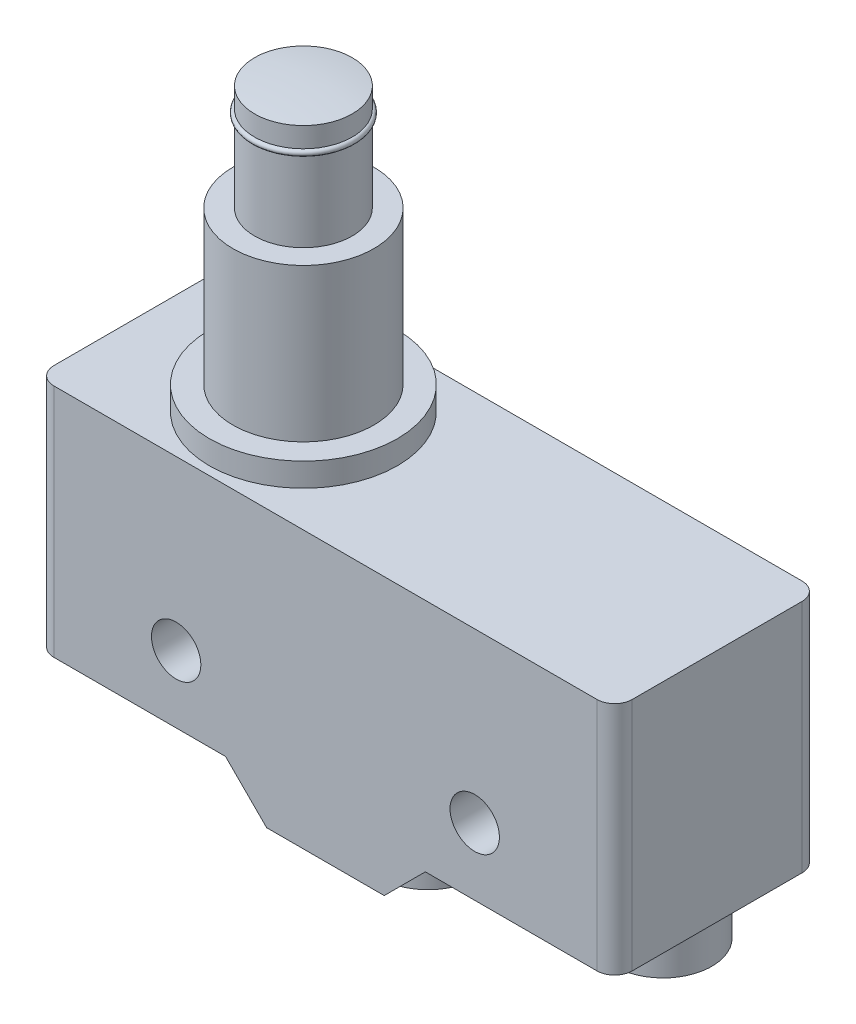
ISO-10303-21;
HEADER;
FILE_DESCRIPTION(('STEP AP214'),'2;1');
FILE_NAME('part.step','',(''),(''),'','','');
FILE_SCHEMA(('AUTOMOTIVE_DESIGN { 1 0 10303 214 1 1 1 1 }'));
ENDSEC;
DATA;
#1=APPLICATION_CONTEXT('core data for automotive mechanical design processes');
#2=APPLICATION_PROTOCOL_DEFINITION('international standard','automotive_design',2000,#1);
#3=PRODUCT_CONTEXT('',#1,'mechanical');
#4=PRODUCT('Part','Part','',(#3));
#5=PRODUCT_RELATED_PRODUCT_CATEGORY('part','',(#4));
#6=PRODUCT_DEFINITION_FORMATION('','',#4);
#7=PRODUCT_DEFINITION_CONTEXT('part definition',#1,'design');
#8=PRODUCT_DEFINITION('design','',#6,#7);
#9=PRODUCT_DEFINITION_SHAPE('','',#8);
#10=(LENGTH_UNIT() NAMED_UNIT(*) SI_UNIT(.MILLI.,.METRE.));
#11=(NAMED_UNIT(*) PLANE_ANGLE_UNIT() SI_UNIT($,.RADIAN.));
#12=(NAMED_UNIT(*) SI_UNIT($,.STERADIAN.) SOLID_ANGLE_UNIT());
#13=UNCERTAINTY_MEASURE_WITH_UNIT(LENGTH_MEASURE(1.E-05),#10,'distance_accuracy_value','');
#14=(GEOMETRIC_REPRESENTATION_CONTEXT(3) GLOBAL_UNCERTAINTY_ASSIGNED_CONTEXT((#13)) GLOBAL_UNIT_ASSIGNED_CONTEXT((#10,
#11,#12)) REPRESENTATION_CONTEXT('',''));
#15=CARTESIAN_POINT('',(0.,0.,0.));
#16=DIRECTION('',(0.,0.,1.));
#17=DIRECTION('',(1.,0.,0.));
#18=AXIS2_PLACEMENT_3D('',#15,#16,#17);
#19=CARTESIAN_POINT('',(-5.,-13.5,17.45));
#20=DIRECTION('',(0.,1.,0.));
#21=DIRECTION('',(-1.,0.,0.));
#22=AXIS2_PLACEMENT_3D('',#19,#20,#21);
#23=PLANE('',#22);
#24=DIRECTION('',(1.,0.,0.));
#25=VECTOR('',#24,1.);
#26=CARTESIAN_POINT('',(-5.,-13.5,0.));
#27=LINE('',#26,#25);
#28=CARTESIAN_POINT('',(-5.,-13.5,0.));
#29=VERTEX_POINT('',#28);
#30=CARTESIAN_POINT('',(5.,-13.5,0.));
#31=VERTEX_POINT('',#30);
#32=EDGE_CURVE('E236',#29,#31,#27,.T.);
#33=ORIENTED_EDGE('',*,*,#32,.T.);
#34=DIRECTION('',(0.,0.,-1.));
#35=VECTOR('',#34,1.);
#36=CARTESIAN_POINT('',(5.,-13.5,17.45));
#37=LINE('',#36,#35);
#38=CARTESIAN_POINT('',(5.,-13.5,17.45));
#39=VERTEX_POINT('',#38);
#40=EDGE_CURVE('E155',#39,#31,#37,.T.);
#41=ORIENTED_EDGE('',*,*,#40,.F.);
#42=DIRECTION('',(1.,0.,0.));
#43=VECTOR('',#42,1.);
#44=CARTESIAN_POINT('',(-5.,-13.5,17.45));
#45=LINE('',#44,#43);
#46=CARTESIAN_POINT('',(-5.,-13.5,17.45));
#47=VERTEX_POINT('',#46);
#48=EDGE_CURVE('E143',#47,#39,#45,.T.);
#49=ORIENTED_EDGE('',*,*,#48,.F.);
#50=DIRECTION('',(0.,0.,-1.));
#51=VECTOR('',#50,1.);
#52=CARTESIAN_POINT('',(-5.,-13.5,17.45));
#53=LINE('',#52,#51);
#54=EDGE_CURVE('E141',#47,#29,#53,.T.);
#55=ORIENTED_EDGE('',*,*,#54,.T.);
#56=EDGE_LOOP('',(#33,#41,#49,#55));
#57=FACE_BOUND('',#56,.T.);
#58=CARTESIAN_POINT('',(0.,-13.5,8.72499999999916));
#59=DIRECTION('',(0.,1.,0.));
#60=DIRECTION('',(-1.,0.,0.));
#61=AXIS2_PLACEMENT_3D('',#58,#59,#60);
#62=CIRCLE('',#61,4.15);
#63=CARTESIAN_POINT('',(-4.15,-13.5,8.72499999999916));
#64=VERTEX_POINT('',#63);
#65=EDGE_CURVE('E161',#64,#64,#62,.F.);
#66=ORIENTED_EDGE('',*,*,#65,.F.);
#67=EDGE_LOOP('',(#66));
#68=FACE_BOUND('',#67,.T.);
#69=ADVANCED_FACE('F34',(#57,#68),#23,.F.);
#70=CARTESIAN_POINT('',(24.6,-10.,17.45));
#71=DIRECTION('',(0.,1.,0.));
#72=DIRECTION('',(-1.,0.,0.));
#73=AXIS2_PLACEMENT_3D('',#70,#71,#72);
#74=PLANE('',#73);
#75=DIRECTION('',(1.,0.,0.));
#76=VECTOR('',#75,1.);
#77=CARTESIAN_POINT('',(24.6,-10.,0.));
#78=LINE('',#77,#76);
#79=CARTESIAN_POINT('',(8.5,-10.,0.));
#80=VERTEX_POINT('',#79);
#81=CARTESIAN_POINT('',(23.1,-10.,0.));
#82=VERTEX_POINT('',#81);
#83=EDGE_CURVE('E237',#80,#82,#78,.T.);
#84=ORIENTED_EDGE('',*,*,#83,.T.);
#85=CARTESIAN_POINT('',(23.1,-10.,1.5));
#86=DIRECTION('',(0.,1.,0.));
#87=DIRECTION('',(-1.,0.,0.));
#88=AXIS2_PLACEMENT_3D('',#85,#86,#87);
#89=CIRCLE('',#88,1.5);
#90=CARTESIAN_POINT('',(24.6,-10.,1.5));
#91=VERTEX_POINT('',#90);
#92=EDGE_CURVE('E11',#82,#91,#89,.F.);
#93=ORIENTED_EDGE('',*,*,#92,.T.);
#94=DIRECTION('',(0.,0.,-1.));
#95=VECTOR('',#94,1.);
#96=CARTESIAN_POINT('',(24.6,-10.,17.45));
#97=LINE('',#96,#95);
#98=CARTESIAN_POINT('',(24.6,-10.,15.95));
#99=VERTEX_POINT('',#98);
#100=EDGE_CURVE('E199',#99,#91,#97,.T.);
#101=ORIENTED_EDGE('',*,*,#100,.F.);
#102=CARTESIAN_POINT('',(23.1,-10.,15.95));
#103=DIRECTION('',(0.,1.,0.));
#104=DIRECTION('',(-1.,0.,0.));
#105=AXIS2_PLACEMENT_3D('',#102,#103,#104);
#106=CIRCLE('',#105,1.5);
#107=CARTESIAN_POINT('',(23.1,-10.,17.45));
#108=VERTEX_POINT('',#107);
#109=EDGE_CURVE('E42',#99,#108,#106,.F.);
#110=ORIENTED_EDGE('',*,*,#109,.T.);
#111=DIRECTION('',(1.,0.,0.));
#112=VECTOR('',#111,1.);
#113=CARTESIAN_POINT('',(24.6,-10.,17.45));
#114=LINE('',#113,#112);
#115=CARTESIAN_POINT('',(8.5,-10.,17.45));
#116=VERTEX_POINT('',#115);
#117=EDGE_CURVE('E198',#116,#108,#114,.T.);
#118=ORIENTED_EDGE('',*,*,#117,.F.);
#119=DIRECTION('',(0.,0.,-1.));
#120=VECTOR('',#119,1.);
#121=CARTESIAN_POINT('',(8.5,-10.,17.45));
#122=LINE('',#121,#120);
#123=EDGE_CURVE('E217',#116,#80,#122,.T.);
#124=ORIENTED_EDGE('',*,*,#123,.T.);
#125=EDGE_LOOP('',(#84,#93,#101,#110,#118,#124));
#126=FACE_BOUND('',#125,.T.);
#127=CARTESIAN_POINT('',(20.,-10.,8.725));
#128=DIRECTION('',(0.,1.,0.));
#129=DIRECTION('',(-1.,0.,0.));
#130=AXIS2_PLACEMENT_3D('',#127,#128,#129);
#131=CIRCLE('',#130,4.15);
#132=CARTESIAN_POINT('',(15.85,-10.,8.725));
#133=VERTEX_POINT('',#132);
#134=EDGE_CURVE('E153',#133,#133,#131,.F.);
#135=ORIENTED_EDGE('',*,*,#134,.F.);
#136=EDGE_LOOP('',(#135));
#137=FACE_BOUND('',#136,.T.);
#138=ADVANCED_FACE('F195',(#126,#137),#74,.F.);
#139=CARTESIAN_POINT('',(-8.5,-10.,17.45));
#140=DIRECTION('',(0.,1.,0.));
#141=DIRECTION('',(-1.,0.,0.));
#142=AXIS2_PLACEMENT_3D('',#139,#140,#141);
#143=PLANE('',#142);
#144=DIRECTION('',(1.,0.,0.));
#145=VECTOR('',#144,1.);
#146=CARTESIAN_POINT('',(-8.5,-10.,17.45));
#147=LINE('',#146,#145);
#148=CARTESIAN_POINT('',(-23.1,-10.,17.45));
#149=VERTEX_POINT('',#148);
#150=CARTESIAN_POINT('',(-8.5,-10.,17.45));
#151=VERTEX_POINT('',#150);
#152=EDGE_CURVE('E123',#149,#151,#147,.T.);
#153=ORIENTED_EDGE('',*,*,#152,.F.);
#154=CARTESIAN_POINT('',(-23.1,-10.,15.95));
#155=DIRECTION('',(0.,1.,0.));
#156=DIRECTION('',(-1.,0.,0.));
#157=AXIS2_PLACEMENT_3D('',#154,#155,#156);
#158=CIRCLE('',#157,1.5);
#159=CARTESIAN_POINT('',(-24.6,-10.,15.95));
#160=VERTEX_POINT('',#159);
#161=EDGE_CURVE('E170',#149,#160,#158,.F.);
#162=ORIENTED_EDGE('',*,*,#161,.T.);
#163=DIRECTION('',(0.,0.,-1.));
#164=VECTOR('',#163,1.);
#165=CARTESIAN_POINT('',(-24.6,-10.,17.45));
#166=LINE('',#165,#164);
#167=CARTESIAN_POINT('',(-24.6,-10.,1.5));
#168=VERTEX_POINT('',#167);
#169=EDGE_CURVE('E220',#160,#168,#166,.T.);
#170=ORIENTED_EDGE('',*,*,#169,.T.);
#171=CARTESIAN_POINT('',(-23.1,-10.,1.5));
#172=DIRECTION('',(0.,1.,0.));
#173=DIRECTION('',(-1.,0.,0.));
#174=AXIS2_PLACEMENT_3D('',#171,#172,#173);
#175=CIRCLE('',#174,1.5);
#176=CARTESIAN_POINT('',(-23.1,-10.,0.));
#177=VERTEX_POINT('',#176);
#178=EDGE_CURVE('E168',#168,#177,#175,.F.);
#179=ORIENTED_EDGE('',*,*,#178,.T.);
#180=DIRECTION('',(1.,0.,0.));
#181=VECTOR('',#180,1.);
#182=CARTESIAN_POINT('',(-8.5,-10.,0.));
#183=LINE('',#182,#181);
#184=CARTESIAN_POINT('',(-8.5,-10.,0.));
#185=VERTEX_POINT('',#184);
#186=EDGE_CURVE('E148',#177,#185,#183,.T.);
#187=ORIENTED_EDGE('',*,*,#186,.T.);
#188=DIRECTION('',(0.,0.,-1.));
#189=VECTOR('',#188,1.);
#190=CARTESIAN_POINT('',(-8.5,-10.,17.45));
#191=LINE('',#190,#189);
#192=EDGE_CURVE('E139',#151,#185,#191,.T.);
#193=ORIENTED_EDGE('',*,*,#192,.F.);
#194=EDGE_LOOP('',(#153,#162,#170,#179,#187,#193));
#195=FACE_BOUND('',#194,.T.);
#196=CARTESIAN_POINT('',(-20.,-10.,8.72499999999999));
#197=DIRECTION('',(0.,1.,0.));
#198=DIRECTION('',(-1.,0.,0.));
#199=AXIS2_PLACEMENT_3D('',#196,#197,#198);
#200=CIRCLE('',#199,4.15);
#201=CARTESIAN_POINT('',(-24.15,-10.,8.72499999999999));
#202=VERTEX_POINT('',#201);
#203=EDGE_CURVE('E150',#202,#202,#200,.F.);
#204=ORIENTED_EDGE('',*,*,#203,.F.);
#205=EDGE_LOOP('',(#204));
#206=FACE_BOUND('',#205,.T.);
#207=ADVANCED_FACE('F145',(#195,#206),#143,.F.);
#208=CARTESIAN_POINT('',(-24.6,-10.,17.45));
#209=DIRECTION('',(0.,0.,1.));
#210=DIRECTION('',(1.,0.,0.));
#211=AXIS2_PLACEMENT_3D('',#208,#209,#210);
#212=PLANE('',#211);
#213=CARTESIAN_POINT('',(-12.7,-4.3,17.45));
#214=DIRECTION('',(0.,0.,1.));
#215=DIRECTION('',(1.,0.,0.));
#216=AXIS2_PLACEMENT_3D('',#213,#214,#215);
#217=CIRCLE('',#216,2.1);
#218=CARTESIAN_POINT('',(-10.6,-4.3,17.45));
#219=VERTEX_POINT('',#218);
#220=EDGE_CURVE('E250',#219,#219,#217,.T.);
#221=ORIENTED_EDGE('',*,*,#220,.F.);
#222=EDGE_LOOP('',(#221));
#223=FACE_BOUND('',#222,.T.);
#224=DIRECTION('',(-1.,0.,0.));
#225=VECTOR('',#224,1.);
#226=CARTESIAN_POINT('',(24.6,10.,17.45));
#227=LINE('',#226,#225);
#228=CARTESIAN_POINT('',(23.1,10.,17.45));
#229=VERTEX_POINT('',#228);
#230=CARTESIAN_POINT('',(-23.1,10.,17.45));
#231=VERTEX_POINT('',#230);
#232=EDGE_CURVE('E206',#229,#231,#227,.T.);
#233=ORIENTED_EDGE('',*,*,#232,.T.);
#234=DIRECTION('',(0.,-1.,0.));
#235=VECTOR('',#234,1.);
#236=CARTESIAN_POINT('',(-23.1,-10.,17.45));
#237=LINE('',#236,#235);
#238=EDGE_CURVE('E131',#231,#149,#237,.T.);
#239=ORIENTED_EDGE('',*,*,#238,.T.);
#240=ORIENTED_EDGE('',*,*,#152,.T.);
#241=DIRECTION('',(0.707106781186548,-0.707106781186547,0.));
#242=VECTOR('',#241,1.);
#243=CARTESIAN_POINT('',(-5.,-13.5,17.45));
#244=LINE('',#243,#242);
#245=EDGE_CURVE('E128',#151,#47,#244,.T.);
#246=ORIENTED_EDGE('',*,*,#245,.T.);
#247=ORIENTED_EDGE('',*,*,#48,.T.);
#248=DIRECTION('',(0.707106781186548,0.707106781186547,0.));
#249=VECTOR('',#248,1.);
#250=CARTESIAN_POINT('',(5.,-13.5,17.45));
#251=LINE('',#250,#249);
#252=EDGE_CURVE('E204',#39,#116,#251,.T.);
#253=ORIENTED_EDGE('',*,*,#252,.T.);
#254=ORIENTED_EDGE('',*,*,#117,.T.);
#255=DIRECTION('',(0.,1.,0.));
#256=VECTOR('',#255,1.);
#257=CARTESIAN_POINT('',(23.1,10.,17.45));
#258=LINE('',#257,#256);
#259=EDGE_CURVE('E164',#108,#229,#258,.T.);
#260=ORIENTED_EDGE('',*,*,#259,.T.);
#261=EDGE_LOOP('',(#233,#239,#240,#246,#247,#253,#254,#260));
#262=FACE_BOUND('',#261,.T.);
#263=CARTESIAN_POINT('',(12.7,-4.29999999999999,17.45));
#264=DIRECTION('',(0.,0.,1.));
#265=DIRECTION('',(-1.,0.,0.));
#266=AXIS2_PLACEMENT_3D('',#263,#264,#265);
#267=CIRCLE('',#266,2.1);
#268=CARTESIAN_POINT('',(10.6,-4.29999999999999,17.45));
#269=VERTEX_POINT('',#268);
#270=EDGE_CURVE('E257',#269,#269,#267,.T.);
#271=ORIENTED_EDGE('',*,*,#270,.F.);
#272=EDGE_LOOP('',(#271));
#273=FACE_BOUND('',#272,.T.);
#274=ADVANCED_FACE('F126',(#223,#262,#273),#212,.T.);
#275=CARTESIAN_POINT('',(-24.6,-10.,0.));
#276=DIRECTION('',(0.,0.,1.));
#277=DIRECTION('',(1.,0.,0.));
#278=AXIS2_PLACEMENT_3D('',#275,#276,#277);
#279=PLANE('',#278);
#280=CARTESIAN_POINT('',(-12.7,-4.3,0.));
#281=DIRECTION('',(0.,0.,1.));
#282=DIRECTION('',(1.,0.,0.));
#283=AXIS2_PLACEMENT_3D('',#280,#281,#282);
#284=CIRCLE('',#283,2.1);
#285=CARTESIAN_POINT('',(-10.6,-4.3,0.));
#286=VERTEX_POINT('',#285);
#287=EDGE_CURVE('E254',#286,#286,#284,.T.);
#288=ORIENTED_EDGE('',*,*,#287,.T.);
#289=EDGE_LOOP('',(#288));
#290=FACE_BOUND('',#289,.T.);
#291=ORIENTED_EDGE('',*,*,#186,.F.);
#292=DIRECTION('',(0.,-1.,0.));
#293=VECTOR('',#292,1.);
#294=CARTESIAN_POINT('',(-23.1,-10.,0.));
#295=LINE('',#294,#293);
#296=CARTESIAN_POINT('',(-23.1,10.,0.));
#297=VERTEX_POINT('',#296);
#298=EDGE_CURVE('E187',#177,#297,#295,.F.);
#299=ORIENTED_EDGE('',*,*,#298,.T.);
#300=DIRECTION('',(-1.,0.,0.));
#301=VECTOR('',#300,1.);
#302=CARTESIAN_POINT('',(24.6,10.,0.));
#303=LINE('',#302,#301);
#304=CARTESIAN_POINT('',(23.1,10.,0.));
#305=VERTEX_POINT('',#304);
#306=EDGE_CURVE('E134',#305,#297,#303,.T.);
#307=ORIENTED_EDGE('',*,*,#306,.F.);
#308=DIRECTION('',(0.,1.,0.));
#309=VECTOR('',#308,1.);
#310=CARTESIAN_POINT('',(23.1,-10.,0.));
#311=LINE('',#310,#309);
#312=EDGE_CURVE('E185',#305,#82,#311,.F.);
#313=ORIENTED_EDGE('',*,*,#312,.T.);
#314=ORIENTED_EDGE('',*,*,#83,.F.);
#315=DIRECTION('',(0.707106781186548,0.707106781186547,0.));
#316=VECTOR('',#315,1.);
#317=CARTESIAN_POINT('',(5.,-13.5,0.));
#318=LINE('',#317,#316);
#319=EDGE_CURVE('E229',#31,#80,#318,.T.);
#320=ORIENTED_EDGE('',*,*,#319,.F.);
#321=ORIENTED_EDGE('',*,*,#32,.F.);
#322=DIRECTION('',(0.707106781186548,-0.707106781186547,0.));
#323=VECTOR('',#322,1.);
#324=CARTESIAN_POINT('',(-5.,-13.5,0.));
#325=LINE('',#324,#323);
#326=EDGE_CURVE('E240',#185,#29,#325,.T.);
#327=ORIENTED_EDGE('',*,*,#326,.F.);
#328=EDGE_LOOP('',(#291,#299,#307,#313,#314,#320,#321,#327));
#329=FACE_BOUND('',#328,.T.);
#330=CARTESIAN_POINT('',(12.7,-4.29999999999999,0.));
#331=DIRECTION('',(0.,0.,1.));
#332=DIRECTION('',(-1.,0.,0.));
#333=AXIS2_PLACEMENT_3D('',#330,#331,#332);
#334=CIRCLE('',#333,2.1);
#335=CARTESIAN_POINT('',(10.6,-4.29999999999999,0.));
#336=VERTEX_POINT('',#335);
#337=EDGE_CURVE('E260',#336,#336,#334,.T.);
#338=ORIENTED_EDGE('',*,*,#337,.T.);
#339=EDGE_LOOP('',(#338));
#340=FACE_BOUND('',#339,.T.);
#341=ADVANCED_FACE('F234',(#290,#329,#340),#279,.F.);
#342=CARTESIAN_POINT('',(-5.,-13.5,17.45));
#343=DIRECTION('',(0.707106781186547,0.707106781186548,0.));
#344=DIRECTION('',(-0.707106781186548,0.707106781186547,0.));
#345=AXIS2_PLACEMENT_3D('',#342,#343,#344);
#346=PLANE('',#345);
#347=ORIENTED_EDGE('',*,*,#326,.T.);
#348=ORIENTED_EDGE('',*,*,#54,.F.);
#349=ORIENTED_EDGE('',*,*,#245,.F.);
#350=ORIENTED_EDGE('',*,*,#192,.T.);
#351=EDGE_LOOP('',(#347,#348,#349,#350));
#352=FACE_BOUND('',#351,.T.);
#353=ADVANCED_FACE('F138',(#352),#346,.F.);
#354=CARTESIAN_POINT('',(5.,-13.5,17.45));
#355=DIRECTION('',(-0.707106781186547,0.707106781186548,0.));
#356=DIRECTION('',(-0.707106781186548,-0.707106781186547,0.));
#357=AXIS2_PLACEMENT_3D('',#354,#355,#356);
#358=PLANE('',#357);
#359=ORIENTED_EDGE('',*,*,#319,.T.);
#360=ORIENTED_EDGE('',*,*,#123,.F.);
#361=ORIENTED_EDGE('',*,*,#252,.F.);
#362=ORIENTED_EDGE('',*,*,#40,.T.);
#363=EDGE_LOOP('',(#359,#360,#361,#362));
#364=FACE_BOUND('',#363,.T.);
#365=ADVANCED_FACE('F228',(#364),#358,.F.);
#366=CARTESIAN_POINT('',(24.6,10.,17.45));
#367=DIRECTION('',(-1.,0.,0.));
#368=DIRECTION('',(0.,0.,1.));
#369=AXIS2_PLACEMENT_3D('',#366,#367,#368);
#370=PLANE('',#369);
#371=ORIENTED_EDGE('',*,*,#100,.T.);
#372=DIRECTION('',(0.,1.,0.));
#373=VECTOR('',#372,1.);
#374=CARTESIAN_POINT('',(24.6,10.,1.5));
#375=LINE('',#374,#373);
#376=CARTESIAN_POINT('',(24.6,10.,1.5));
#377=VERTEX_POINT('',#376);
#378=EDGE_CURVE('E190',#91,#377,#375,.T.);
#379=ORIENTED_EDGE('',*,*,#378,.T.);
#380=DIRECTION('',(0.,0.,-1.));
#381=VECTOR('',#380,1.);
#382=CARTESIAN_POINT('',(24.6,10.,17.45));
#383=LINE('',#382,#381);
#384=CARTESIAN_POINT('',(24.6,10.,15.95));
#385=VERTEX_POINT('',#384);
#386=EDGE_CURVE('E212',#385,#377,#383,.T.);
#387=ORIENTED_EDGE('',*,*,#386,.F.);
#388=DIRECTION('',(0.,1.,0.));
#389=VECTOR('',#388,1.);
#390=CARTESIAN_POINT('',(24.6,-10.,15.95));
#391=LINE('',#390,#389);
#392=EDGE_CURVE('E54',#385,#99,#391,.F.);
#393=ORIENTED_EDGE('',*,*,#392,.T.);
#394=EDGE_LOOP('',(#371,#379,#387,#393));
#395=FACE_BOUND('',#394,.T.);
#396=ADVANCED_FACE('F213',(#395),#370,.F.);
#397=CARTESIAN_POINT('',(24.6,10.,17.45));
#398=DIRECTION('',(0.,-1.,0.));
#399=DIRECTION('',(1.,0.,0.));
#400=AXIS2_PLACEMENT_3D('',#397,#398,#399);
#401=PLANE('',#400);
#402=CARTESIAN_POINT('',(-10.6,10.,8.725));
#403=DIRECTION('',(0.,1.,0.));
#404=DIRECTION('',(-1.,0.,0.));
#405=AXIS2_PLACEMENT_3D('',#402,#403,#404);
#406=CIRCLE('',#405,8.);
#407=CARTESIAN_POINT('',(-18.6,10.,8.725));
#408=VERTEX_POINT('',#407);
#409=EDGE_CURVE('E295',#408,#408,#406,.T.);
#410=ORIENTED_EDGE('',*,*,#409,.F.);
#411=EDGE_LOOP('',(#410));
#412=FACE_BOUND('',#411,.T.);
#413=DIRECTION('',(0.,0.,-1.));
#414=VECTOR('',#413,1.);
#415=CARTESIAN_POINT('',(-24.6,10.,17.45));
#416=LINE('',#415,#414);
#417=CARTESIAN_POINT('',(-24.6,10.,15.95));
#418=VERTEX_POINT('',#417);
#419=CARTESIAN_POINT('',(-24.6,10.,1.5));
#420=VERTEX_POINT('',#419);
#421=EDGE_CURVE('E215',#418,#420,#416,.T.);
#422=ORIENTED_EDGE('',*,*,#421,.F.);
#423=CARTESIAN_POINT('',(-23.1,10.,15.95));
#424=DIRECTION('',(0.,-1.,0.));
#425=DIRECTION('',(1.,0.,0.));
#426=AXIS2_PLACEMENT_3D('',#423,#424,#425);
#427=CIRCLE('',#426,1.5);
#428=EDGE_CURVE('E183',#418,#231,#427,.F.);
#429=ORIENTED_EDGE('',*,*,#428,.T.);
#430=ORIENTED_EDGE('',*,*,#232,.F.);
#431=CARTESIAN_POINT('',(23.1,10.,15.95));
#432=DIRECTION('',(0.,-1.,0.));
#433=DIRECTION('',(1.,0.,0.));
#434=AXIS2_PLACEMENT_3D('',#431,#432,#433);
#435=CIRCLE('',#434,1.5);
#436=EDGE_CURVE('E177',#229,#385,#435,.F.);
#437=ORIENTED_EDGE('',*,*,#436,.T.);
#438=ORIENTED_EDGE('',*,*,#386,.T.);
#439=CARTESIAN_POINT('',(23.1,10.,1.5));
#440=DIRECTION('',(0.,-1.,0.));
#441=DIRECTION('',(1.,0.,0.));
#442=AXIS2_PLACEMENT_3D('',#439,#440,#441);
#443=CIRCLE('',#442,1.5);
#444=EDGE_CURVE('E179',#377,#305,#443,.F.);
#445=ORIENTED_EDGE('',*,*,#444,.T.);
#446=ORIENTED_EDGE('',*,*,#306,.T.);
#447=CARTESIAN_POINT('',(-23.1,10.,1.5));
#448=DIRECTION('',(0.,-1.,0.));
#449=DIRECTION('',(1.,0.,0.));
#450=AXIS2_PLACEMENT_3D('',#447,#448,#449);
#451=CIRCLE('',#450,1.5);
#452=EDGE_CURVE('E181',#297,#420,#451,.F.);
#453=ORIENTED_EDGE('',*,*,#452,.T.);
#454=EDGE_LOOP('',(#422,#429,#430,#437,#438,#445,#446,#453));
#455=FACE_BOUND('',#454,.T.);
#456=ADVANCED_FACE('F211',(#412,#455),#401,.F.);
#457=CARTESIAN_POINT('',(-24.6,10.,17.45));
#458=DIRECTION('',(1.,0.,0.));
#459=DIRECTION('',(0.,1.,0.));
#460=AXIS2_PLACEMENT_3D('',#457,#458,#459);
#461=PLANE('',#460);
#462=ORIENTED_EDGE('',*,*,#169,.F.);
#463=DIRECTION('',(0.,-1.,0.));
#464=VECTOR('',#463,1.);
#465=CARTESIAN_POINT('',(-24.6,10.,15.95));
#466=LINE('',#465,#464);
#467=EDGE_CURVE('E175',#160,#418,#466,.F.);
#468=ORIENTED_EDGE('',*,*,#467,.T.);
#469=ORIENTED_EDGE('',*,*,#421,.T.);
#470=DIRECTION('',(0.,-1.,0.));
#471=VECTOR('',#470,1.);
#472=CARTESIAN_POINT('',(-24.6,10.,1.5));
#473=LINE('',#472,#471);
#474=EDGE_CURVE('E172',#420,#168,#473,.T.);
#475=ORIENTED_EDGE('',*,*,#474,.T.);
#476=EDGE_LOOP('',(#462,#468,#469,#475));
#477=FACE_BOUND('',#476,.T.);
#478=ADVANCED_FACE('F303',(#477),#461,.F.);
#479=CARTESIAN_POINT('',(-12.7,-4.3,17.45));
#480=DIRECTION('',(0.,0.,-1.));
#481=DIRECTION('',(-1.,0.,0.));
#482=AXIS2_PLACEMENT_3D('',#479,#480,#481);
#483=CYLINDRICAL_SURFACE('',#482,2.1);
#484=ORIENTED_EDGE('',*,*,#220,.T.);
#485=EDGE_LOOP('',(#484));
#486=FACE_BOUND('',#485,.T.);
#487=ORIENTED_EDGE('',*,*,#287,.F.);
#488=EDGE_LOOP('',(#487));
#489=FACE_BOUND('',#488,.T.);
#490=ADVANCED_FACE('F309',(#486,#489),#483,.F.);
#491=CARTESIAN_POINT('',(12.7,-4.29999999999999,17.45));
#492=DIRECTION('',(0.,0.,-1.));
#493=DIRECTION('',(-1.,0.,0.));
#494=AXIS2_PLACEMENT_3D('',#491,#492,#493);
#495=CYLINDRICAL_SURFACE('',#494,2.1);
#496=ORIENTED_EDGE('',*,*,#270,.T.);
#497=EDGE_LOOP('',(#496));
#498=FACE_BOUND('',#497,.T.);
#499=ORIENTED_EDGE('',*,*,#337,.F.);
#500=EDGE_LOOP('',(#499));
#501=FACE_BOUND('',#500,.T.);
#502=ADVANCED_FACE('F569',(#498,#501),#495,.F.);
#503=CARTESIAN_POINT('',(-20.,-13.5,8.72499999999999));
#504=DIRECTION('',(0.,1.,0.));
#505=DIRECTION('',(-1.,0.,0.));
#506=AXIS2_PLACEMENT_3D('',#503,#504,#505);
#507=CYLINDRICAL_SURFACE('',#506,4.15);
#508=CARTESIAN_POINT('',(-20.,-13.5,8.72499999999999));
#509=DIRECTION('',(0.,-1.,0.));
#510=DIRECTION('',(1.,0.,0.));
#511=AXIS2_PLACEMENT_3D('',#508,#509,#510);
#512=CIRCLE('',#511,4.15);
#513=CARTESIAN_POINT('',(-15.85,-13.5,8.72499999999999));
#514=VERTEX_POINT('',#513);
#515=EDGE_CURVE('E263',#514,#514,#512,.T.);
#516=ORIENTED_EDGE('',*,*,#515,.F.);
#517=EDGE_LOOP('',(#516));
#518=FACE_BOUND('',#517,.T.);
#519=ORIENTED_EDGE('',*,*,#203,.T.);
#520=EDGE_LOOP('',(#519));
#521=FACE_BOUND('',#520,.T.);
#522=ADVANCED_FACE('F560',(#518,#521),#507,.T.);
#523=CARTESIAN_POINT('',(-20.,-13.5,8.72499999999999));
#524=DIRECTION('',(0.,-1.,0.));
#525=DIRECTION('',(1.,0.,0.));
#526=AXIS2_PLACEMENT_3D('',#523,#524,#525);
#527=PLANE('',#526);
#528=ORIENTED_EDGE('',*,*,#515,.T.);
#529=EDGE_LOOP('',(#528));
#530=FACE_BOUND('',#529,.T.);
#531=ADVANCED_FACE('F548',(#530),#527,.T.);
#532=CARTESIAN_POINT('',(20.,-13.5,8.725));
#533=DIRECTION('',(0.,1.,0.));
#534=DIRECTION('',(-1.,0.,0.));
#535=AXIS2_PLACEMENT_3D('',#532,#533,#534);
#536=CYLINDRICAL_SURFACE('',#535,4.15);
#537=CARTESIAN_POINT('',(20.,-13.5,8.725));
#538=DIRECTION('',(0.,-1.,0.));
#539=DIRECTION('',(-1.,0.,0.));
#540=AXIS2_PLACEMENT_3D('',#537,#538,#539);
#541=CIRCLE('',#540,4.15);
#542=CARTESIAN_POINT('',(15.85,-13.5,8.725));
#543=VERTEX_POINT('',#542);
#544=EDGE_CURVE('E268',#543,#543,#541,.T.);
#545=ORIENTED_EDGE('',*,*,#544,.F.);
#546=EDGE_LOOP('',(#545));
#547=FACE_BOUND('',#546,.T.);
#548=ORIENTED_EDGE('',*,*,#134,.T.);
#549=EDGE_LOOP('',(#548));
#550=FACE_BOUND('',#549,.T.);
#551=ADVANCED_FACE('F537',(#547,#550),#536,.T.);
#552=CARTESIAN_POINT('',(20.,-13.5,8.725));
#553=DIRECTION('',(0.,1.,0.));
#554=DIRECTION('',(-1.,0.,0.));
#555=AXIS2_PLACEMENT_3D('',#552,#553,#554);
#556=PLANE('',#555);
#557=ORIENTED_EDGE('',*,*,#544,.T.);
#558=EDGE_LOOP('',(#557));
#559=FACE_BOUND('',#558,.T.);
#560=ADVANCED_FACE('F521',(#559),#556,.F.);
#561=CARTESIAN_POINT('',(0.,-17.,8.72499999999916));
#562=DIRECTION('',(0.,1.,0.));
#563=DIRECTION('',(-1.,0.,0.));
#564=AXIS2_PLACEMENT_3D('',#561,#562,#563);
#565=CYLINDRICAL_SURFACE('',#564,4.15);
#566=CARTESIAN_POINT('',(0.,-17.,8.72499999999916));
#567=DIRECTION('',(0.,-1.,0.));
#568=DIRECTION('',(1.,0.,0.));
#569=AXIS2_PLACEMENT_3D('',#566,#567,#568);
#570=CIRCLE('',#569,4.15);
#571=CARTESIAN_POINT('',(4.15,-17.,8.72499999999916));
#572=VERTEX_POINT('',#571);
#573=EDGE_CURVE('E271',#572,#572,#570,.T.);
#574=ORIENTED_EDGE('',*,*,#573,.F.);
#575=EDGE_LOOP('',(#574));
#576=FACE_BOUND('',#575,.T.);
#577=ORIENTED_EDGE('',*,*,#65,.T.);
#578=EDGE_LOOP('',(#577));
#579=FACE_BOUND('',#578,.T.);
#580=ADVANCED_FACE('F511',(#576,#579),#565,.T.);
#581=CARTESIAN_POINT('',(0.,-17.,8.72499999999916));
#582=DIRECTION('',(0.,-1.,0.));
#583=DIRECTION('',(1.,0.,0.));
#584=AXIS2_PLACEMENT_3D('',#581,#582,#583);
#585=PLANE('',#584);
#586=ORIENTED_EDGE('',*,*,#573,.T.);
#587=EDGE_LOOP('',(#586));
#588=FACE_BOUND('',#587,.T.);
#589=ADVANCED_FACE('F501',(#588),#585,.T.);
#590=CARTESIAN_POINT('',(-10.6,4.28842818025274,8.725));
#591=DIRECTION('',(0.,1.,0.));
#592=DIRECTION('',(1.,0.,0.));
#593=AXIS2_PLACEMENT_3D('',#590,#591,#592);
#594=SPHERICAL_SURFACE('',#593,30.);
#595=CARTESIAN_POINT('',(-10.6,34.,8.725));
#596=DIRECTION('',(0.,1.,0.));
#597=DIRECTION('',(-1.,0.,0.));
#598=AXIS2_PLACEMENT_3D('',#595,#596,#597);
#599=CIRCLE('',#598,4.15);
#600=CARTESIAN_POINT('',(-14.75,34.,8.725));
#601=VERTEX_POINT('',#600);
#602=EDGE_CURVE('E274',#601,#601,#599,.T.);
#603=ORIENTED_EDGE('',*,*,#602,.T.);
#604=EDGE_LOOP('',(#603));
#605=FACE_BOUND('',#604,.T.);
#606=ADVANCED_FACE('F490',(#605),#594,.T.);
#607=CARTESIAN_POINT('',(-10.6,27.1364497257593,8.725));
#608=DIRECTION('',(0.,1.,0.));
#609=DIRECTION('',(-1.,0.,0.));
#610=AXIS2_PLACEMENT_3D('',#607,#608,#609);
#611=CYLINDRICAL_SURFACE('',#610,4.15);
#612=CARTESIAN_POINT('',(-10.6,32.2884281802527,8.725));
#613=DIRECTION('',(0.,1.,0.));
#614=DIRECTION('',(-1.,0.,0.));
#615=AXIS2_PLACEMENT_3D('',#612,#613,#614);
#616=CIRCLE('',#615,4.15);
#617=CARTESIAN_POINT('',(-14.75,32.2884281802527,8.725));
#618=VERTEX_POINT('',#617);
#619=EDGE_CURVE('E277',#618,#618,#616,.T.);
#620=ORIENTED_EDGE('',*,*,#619,.T.);
#621=EDGE_LOOP('',(#620));
#622=FACE_BOUND('',#621,.T.);
#623=ORIENTED_EDGE('',*,*,#602,.F.);
#624=EDGE_LOOP('',(#623));
#625=FACE_BOUND('',#624,.T.);
#626=ADVANCED_FACE('F479',(#622,#625),#611,.T.);
#627=CARTESIAN_POINT('',(-10.6,32.0384281802527,8.725));
#628=DIRECTION('',(0.,1.,0.));
#629=DIRECTION('',(-1.,0.,0.));
#630=AXIS2_PLACEMENT_3D('',#627,#628,#629);
#631=TOROIDAL_SURFACE('',#630,4.15,0.25);
#632=CARTESIAN_POINT('',(-10.6,31.7884281802527,8.725));
#633=DIRECTION('',(0.,1.,0.));
#634=DIRECTION('',(-1.,0.,0.));
#635=AXIS2_PLACEMENT_3D('',#632,#633,#634);
#636=CIRCLE('',#635,4.15);
#637=CARTESIAN_POINT('',(-14.75,31.7884281802527,8.725));
#638=VERTEX_POINT('',#637);
#639=EDGE_CURVE('E280',#638,#638,#636,.T.);
#640=ORIENTED_EDGE('',*,*,#639,.T.);
#641=EDGE_LOOP('',(#640));
#642=FACE_BOUND('',#641,.T.);
#643=ORIENTED_EDGE('',*,*,#619,.F.);
#644=EDGE_LOOP('',(#643));
#645=FACE_BOUND('',#644,.T.);
#646=ADVANCED_FACE('F468',(#642,#645),#631,.T.);
#647=CARTESIAN_POINT('',(-10.6,27.1364497257593,8.725));
#648=DIRECTION('',(0.,1.,0.));
#649=DIRECTION('',(-1.,0.,0.));
#650=AXIS2_PLACEMENT_3D('',#647,#648,#649);
#651=CYLINDRICAL_SURFACE('',#650,4.15);
#652=CARTESIAN_POINT('',(-10.6,25.,8.725));
#653=DIRECTION('',(0.,1.,0.));
#654=DIRECTION('',(-1.,0.,0.));
#655=AXIS2_PLACEMENT_3D('',#652,#653,#654);
#656=CIRCLE('',#655,4.15);
#657=CARTESIAN_POINT('',(-14.75,25.,8.725));
#658=VERTEX_POINT('',#657);
#659=EDGE_CURVE('E283',#658,#658,#656,.T.);
#660=ORIENTED_EDGE('',*,*,#659,.T.);
#661=EDGE_LOOP('',(#660));
#662=FACE_BOUND('',#661,.T.);
#663=ORIENTED_EDGE('',*,*,#639,.F.);
#664=EDGE_LOOP('',(#663));
#665=FACE_BOUND('',#664,.T.);
#666=ADVANCED_FACE('F457',(#662,#665),#651,.T.);
#667=CARTESIAN_POINT('',(-16.6,25.,8.725));
#668=DIRECTION('',(0.,1.,0.));
#669=DIRECTION('',(-1.,0.,0.));
#670=AXIS2_PLACEMENT_3D('',#667,#668,#669);
#671=PLANE('',#670);
#672=CARTESIAN_POINT('',(-10.6,25.,8.725));
#673=DIRECTION('',(0.,1.,0.));
#674=DIRECTION('',(-1.,0.,0.));
#675=AXIS2_PLACEMENT_3D('',#672,#673,#674);
#676=CIRCLE('',#675,6.);
#677=CARTESIAN_POINT('',(-16.6,25.,8.725));
#678=VERTEX_POINT('',#677);
#679=EDGE_CURVE('E286',#678,#678,#676,.T.);
#680=ORIENTED_EDGE('',*,*,#679,.T.);
#681=EDGE_LOOP('',(#680));
#682=FACE_BOUND('',#681,.T.);
#683=ORIENTED_EDGE('',*,*,#659,.F.);
#684=EDGE_LOOP('',(#683));
#685=FACE_BOUND('',#684,.T.);
#686=ADVANCED_FACE('F445',(#682,#685),#671,.T.);
#687=CARTESIAN_POINT('',(-10.6,27.1364497257593,8.725));
#688=DIRECTION('',(0.,1.,0.));
#689=DIRECTION('',(-1.,0.,0.));
#690=AXIS2_PLACEMENT_3D('',#687,#688,#689);
#691=CYLINDRICAL_SURFACE('',#690,6.);
#692=CARTESIAN_POINT('',(-10.6,12.,8.725));
#693=DIRECTION('',(0.,1.,0.));
#694=DIRECTION('',(-1.,0.,0.));
#695=AXIS2_PLACEMENT_3D('',#692,#693,#694);
#696=CIRCLE('',#695,6.);
#697=CARTESIAN_POINT('',(-16.6,12.,8.725));
#698=VERTEX_POINT('',#697);
#699=EDGE_CURVE('E289',#698,#698,#696,.T.);
#700=ORIENTED_EDGE('',*,*,#699,.T.);
#701=EDGE_LOOP('',(#700));
#702=FACE_BOUND('',#701,.T.);
#703=ORIENTED_EDGE('',*,*,#679,.F.);
#704=EDGE_LOOP('',(#703));
#705=FACE_BOUND('',#704,.T.);
#706=ADVANCED_FACE('F434',(#702,#705),#691,.T.);
#707=CARTESIAN_POINT('',(-18.6,12.,8.725));
#708=DIRECTION('',(0.,1.,0.));
#709=DIRECTION('',(-1.,0.,0.));
#710=AXIS2_PLACEMENT_3D('',#707,#708,#709);
#711=PLANE('',#710);
#712=CARTESIAN_POINT('',(-10.6,12.,8.725));
#713=DIRECTION('',(0.,1.,0.));
#714=DIRECTION('',(-1.,0.,0.));
#715=AXIS2_PLACEMENT_3D('',#712,#713,#714);
#716=CIRCLE('',#715,8.);
#717=CARTESIAN_POINT('',(-18.6,12.,8.725));
#718=VERTEX_POINT('',#717);
#719=EDGE_CURVE('E292',#718,#718,#716,.T.);
#720=ORIENTED_EDGE('',*,*,#719,.T.);
#721=EDGE_LOOP('',(#720));
#722=FACE_BOUND('',#721,.T.);
#723=ORIENTED_EDGE('',*,*,#699,.F.);
#724=EDGE_LOOP('',(#723));
#725=FACE_BOUND('',#724,.T.);
#726=ADVANCED_FACE('F425',(#722,#725),#711,.T.);
#727=CARTESIAN_POINT('',(-10.6,27.1364497257593,8.725));
#728=DIRECTION('',(0.,1.,0.));
#729=DIRECTION('',(-1.,0.,0.));
#730=AXIS2_PLACEMENT_3D('',#727,#728,#729);
#731=CYLINDRICAL_SURFACE('',#730,8.);
#732=ORIENTED_EDGE('',*,*,#409,.T.);
#733=EDGE_LOOP('',(#732));
#734=FACE_BOUND('',#733,.T.);
#735=ORIENTED_EDGE('',*,*,#719,.F.);
#736=EDGE_LOOP('',(#735));
#737=FACE_BOUND('',#736,.T.);
#738=ADVANCED_FACE('F299',(#734,#737),#731,.T.);
#739=CARTESIAN_POINT('',(-23.1,-10.,15.95));
#740=DIRECTION('',(0.,1.,0.));
#741=DIRECTION('',(-1.,0.,0.));
#742=AXIS2_PLACEMENT_3D('',#739,#740,#741);
#743=CYLINDRICAL_SURFACE('',#742,1.5);
#744=ORIENTED_EDGE('',*,*,#428,.F.);
#745=ORIENTED_EDGE('',*,*,#467,.F.);
#746=ORIENTED_EDGE('',*,*,#161,.F.);
#747=ORIENTED_EDGE('',*,*,#238,.F.);
#748=EDGE_LOOP('',(#744,#745,#746,#747));
#749=FACE_BOUND('',#748,.T.);
#750=ADVANCED_FACE('F325',(#749),#743,.T.);
#751=CARTESIAN_POINT('',(-23.1,10.,1.5));
#752=DIRECTION('',(0.,-1.,0.));
#753=DIRECTION('',(1.,0.,0.));
#754=AXIS2_PLACEMENT_3D('',#751,#752,#753);
#755=CYLINDRICAL_SURFACE('',#754,1.5);
#756=ORIENTED_EDGE('',*,*,#452,.F.);
#757=ORIENTED_EDGE('',*,*,#298,.F.);
#758=ORIENTED_EDGE('',*,*,#178,.F.);
#759=ORIENTED_EDGE('',*,*,#474,.F.);
#760=EDGE_LOOP('',(#756,#757,#758,#759));
#761=FACE_BOUND('',#760,.T.);
#762=ADVANCED_FACE('F328',(#761),#755,.T.);
#763=CARTESIAN_POINT('',(23.1,10.,1.5));
#764=DIRECTION('',(0.,1.,0.));
#765=DIRECTION('',(0.,0.,1.));
#766=AXIS2_PLACEMENT_3D('',#763,#764,#765);
#767=CYLINDRICAL_SURFACE('',#766,1.5);
#768=ORIENTED_EDGE('',*,*,#92,.F.);
#769=ORIENTED_EDGE('',*,*,#312,.F.);
#770=ORIENTED_EDGE('',*,*,#444,.F.);
#771=ORIENTED_EDGE('',*,*,#378,.F.);
#772=EDGE_LOOP('',(#768,#769,#770,#771));
#773=FACE_BOUND('',#772,.T.);
#774=ADVANCED_FACE('F331',(#773),#767,.T.);
#775=CARTESIAN_POINT('',(23.1,-10.,15.95));
#776=DIRECTION('',(0.,-1.,0.));
#777=DIRECTION('',(0.,0.,-1.));
#778=AXIS2_PLACEMENT_3D('',#775,#776,#777);
#779=CYLINDRICAL_SURFACE('',#778,1.5);
#780=ORIENTED_EDGE('',*,*,#109,.F.);
#781=ORIENTED_EDGE('',*,*,#392,.F.);
#782=ORIENTED_EDGE('',*,*,#436,.F.);
#783=ORIENTED_EDGE('',*,*,#259,.F.);
#784=EDGE_LOOP('',(#780,#781,#782,#783));
#785=FACE_BOUND('',#784,.T.);
#786=ADVANCED_FACE('F36',(#785),#779,.T.);
#787=CLOSED_SHELL('',(#69,#138,#207,#274,#341,#353,#365,#396,#456,#478,#490,#502,#522,#531,#551,
#560,#580,#589,#606,#626,#646,#666,#686,#706,#726,#738,#750,#762,#774,#786));
#788=MANIFOLD_SOLID_BREP('B2',#787);
#789=ADVANCED_BREP_SHAPE_REPRESENTATION('',(#18,#788),#14);
#790=SHAPE_DEFINITION_REPRESENTATION(#9,#789);
ENDSEC;
END-ISO-10303-21;
